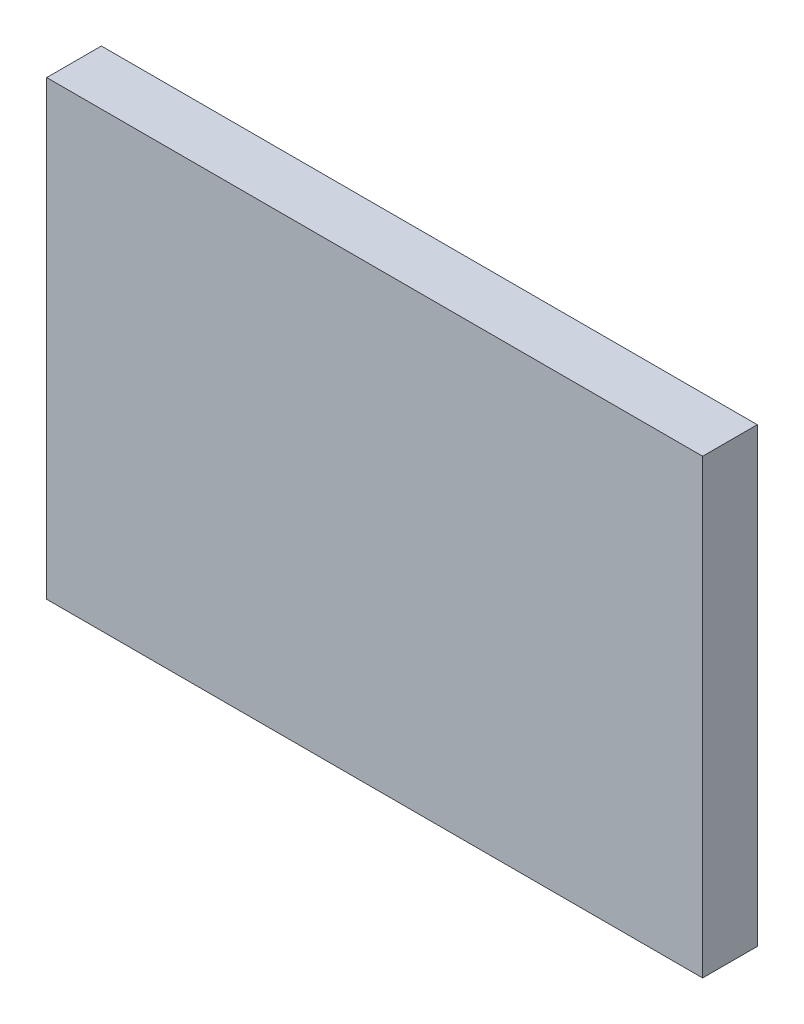
ISO-10303-21;
HEADER;
FILE_DESCRIPTION(('STEP AP214'),'2;1');
FILE_NAME('part.step','',(''),(''),'','','');
FILE_SCHEMA(('AUTOMOTIVE_DESIGN { 1 0 10303 214 1 1 1 1 }'));
ENDSEC;
DATA;
#1=APPLICATION_CONTEXT('core data for automotive mechanical design processes');
#2=APPLICATION_PROTOCOL_DEFINITION('international standard','automotive_design',2000,#1);
#3=PRODUCT_CONTEXT('',#1,'mechanical');
#4=PRODUCT('Part','Part','',(#3));
#5=PRODUCT_RELATED_PRODUCT_CATEGORY('part','',(#4));
#6=PRODUCT_DEFINITION_FORMATION('','',#4);
#7=PRODUCT_DEFINITION_CONTEXT('part definition',#1,'design');
#8=PRODUCT_DEFINITION('design','',#6,#7);
#9=PRODUCT_DEFINITION_SHAPE('','',#8);
#10=(LENGTH_UNIT() NAMED_UNIT(*) SI_UNIT(.MILLI.,.METRE.));
#11=(NAMED_UNIT(*) PLANE_ANGLE_UNIT() SI_UNIT($,.RADIAN.));
#12=(NAMED_UNIT(*) SI_UNIT($,.STERADIAN.) SOLID_ANGLE_UNIT());
#13=UNCERTAINTY_MEASURE_WITH_UNIT(LENGTH_MEASURE(1.E-05),#10,'distance_accuracy_value','');
#14=(GEOMETRIC_REPRESENTATION_CONTEXT(3) GLOBAL_UNCERTAINTY_ASSIGNED_CONTEXT((#13)) GLOBAL_UNIT_ASSIGNED_CONTEXT((#10,
#11,#12)) REPRESENTATION_CONTEXT('',''));
#15=CARTESIAN_POINT('',(0.,0.,0.));
#16=DIRECTION('',(0.,0.,1.));
#17=DIRECTION('',(1.,0.,0.));
#18=AXIS2_PLACEMENT_3D('',#15,#16,#17);
#19=CARTESIAN_POINT('',(22.86,-15.748,3.81));
#20=DIRECTION('',(-1.,0.,0.));
#21=DIRECTION('',(0.,0.,1.));
#22=AXIS2_PLACEMENT_3D('',#19,#20,#21);
#23=PLANE('',#22);
#24=DIRECTION('',(0.,1.,0.));
#25=VECTOR('',#24,1.);
#26=CARTESIAN_POINT('',(22.86,-15.748,0.));
#27=LINE('',#26,#25);
#28=CARTESIAN_POINT('',(22.86,-15.748,0.));
#29=VERTEX_POINT('',#28);
#30=CARTESIAN_POINT('',(22.86,15.748,0.));
#31=VERTEX_POINT('',#30);
#32=EDGE_CURVE('E111',#29,#31,#27,.T.);
#33=ORIENTED_EDGE('',*,*,#32,.T.);
#34=DIRECTION('',(0.,0.,-1.));
#35=VECTOR('',#34,1.);
#36=CARTESIAN_POINT('',(22.86,15.748,3.81));
#37=LINE('',#36,#35);
#38=CARTESIAN_POINT('',(22.86,15.748,3.81));
#39=VERTEX_POINT('',#38);
#40=EDGE_CURVE('E11',#39,#31,#37,.T.);
#41=ORIENTED_EDGE('',*,*,#40,.F.);
#42=DIRECTION('',(0.,1.,0.));
#43=VECTOR('',#42,1.);
#44=CARTESIAN_POINT('',(22.86,-15.748,3.81));
#45=LINE('',#44,#43);
#46=CARTESIAN_POINT('',(22.86,-15.748,3.81));
#47=VERTEX_POINT('',#46);
#48=EDGE_CURVE('E95',#47,#39,#45,.T.);
#49=ORIENTED_EDGE('',*,*,#48,.F.);
#50=DIRECTION('',(0.,0.,-1.));
#51=VECTOR('',#50,1.);
#52=CARTESIAN_POINT('',(22.86,-15.748,3.81));
#53=LINE('',#52,#51);
#54=EDGE_CURVE('E107',#47,#29,#53,.T.);
#55=ORIENTED_EDGE('',*,*,#54,.T.);
#56=EDGE_LOOP('',(#33,#41,#49,#55));
#57=FACE_BOUND('',#56,.T.);
#58=ADVANCED_FACE('F43',(#57),#23,.F.);
#59=CARTESIAN_POINT('',(-22.86,15.748,3.81));
#60=DIRECTION('',(0.,-1.,0.));
#61=DIRECTION('',(0.,0.,-1.));
#62=AXIS2_PLACEMENT_3D('',#59,#60,#61);
#63=PLANE('',#62);
#64=DIRECTION('',(-1.,0.,0.));
#65=VECTOR('',#64,1.);
#66=CARTESIAN_POINT('',(-22.86,15.748,0.));
#67=LINE('',#66,#65);
#68=CARTESIAN_POINT('',(-22.86,15.748,0.));
#69=VERTEX_POINT('',#68);
#70=EDGE_CURVE('E100',#31,#69,#67,.T.);
#71=ORIENTED_EDGE('',*,*,#70,.T.);
#72=DIRECTION('',(0.,0.,-1.));
#73=VECTOR('',#72,1.);
#74=CARTESIAN_POINT('',(-22.86,15.748,3.81));
#75=LINE('',#74,#73);
#76=CARTESIAN_POINT('',(-22.86,15.748,3.81));
#77=VERTEX_POINT('',#76);
#78=EDGE_CURVE('E52',#77,#69,#75,.T.);
#79=ORIENTED_EDGE('',*,*,#78,.F.);
#80=DIRECTION('',(-1.,0.,0.));
#81=VECTOR('',#80,1.);
#82=CARTESIAN_POINT('',(-22.86,15.748,3.81));
#83=LINE('',#82,#81);
#84=EDGE_CURVE('E90',#39,#77,#83,.T.);
#85=ORIENTED_EDGE('',*,*,#84,.F.);
#86=ORIENTED_EDGE('',*,*,#40,.T.);
#87=EDGE_LOOP('',(#71,#79,#85,#86));
#88=FACE_BOUND('',#87,.T.);
#89=ADVANCED_FACE('F99',(#88),#63,.F.);
#90=CARTESIAN_POINT('',(-22.86,-15.748,3.81));
#91=DIRECTION('',(1.,0.,0.));
#92=DIRECTION('',(0.,0.,-1.));
#93=AXIS2_PLACEMENT_3D('',#90,#91,#92);
#94=PLANE('',#93);
#95=DIRECTION('',(0.,-1.,0.));
#96=VECTOR('',#95,1.);
#97=CARTESIAN_POINT('',(-22.86,-15.748,0.));
#98=LINE('',#97,#96);
#99=CARTESIAN_POINT('',(-22.86,-15.748,0.));
#100=VERTEX_POINT('',#99);
#101=EDGE_CURVE('E77',#69,#100,#98,.T.);
#102=ORIENTED_EDGE('',*,*,#101,.T.);
#103=DIRECTION('',(0.,0.,-1.));
#104=VECTOR('',#103,1.);
#105=CARTESIAN_POINT('',(-22.86,-15.748,3.81));
#106=LINE('',#105,#104);
#107=CARTESIAN_POINT('',(-22.86,-15.748,3.81));
#108=VERTEX_POINT('',#107);
#109=EDGE_CURVE('E102',#108,#100,#106,.T.);
#110=ORIENTED_EDGE('',*,*,#109,.F.);
#111=DIRECTION('',(0.,-1.,0.));
#112=VECTOR('',#111,1.);
#113=CARTESIAN_POINT('',(-22.86,-15.748,3.81));
#114=LINE('',#113,#112);
#115=EDGE_CURVE('E93',#77,#108,#114,.T.);
#116=ORIENTED_EDGE('',*,*,#115,.F.);
#117=ORIENTED_EDGE('',*,*,#78,.T.);
#118=EDGE_LOOP('',(#102,#110,#116,#117));
#119=FACE_BOUND('',#118,.T.);
#120=ADVANCED_FACE('F103',(#119),#94,.F.);
#121=CARTESIAN_POINT('',(-22.86,-15.748,3.81));
#122=DIRECTION('',(0.,1.,0.));
#123=DIRECTION('',(0.,0.,1.));
#124=AXIS2_PLACEMENT_3D('',#121,#122,#123);
#125=PLANE('',#124);
#126=DIRECTION('',(1.,0.,0.));
#127=VECTOR('',#126,1.);
#128=CARTESIAN_POINT('',(-22.86,-15.748,0.));
#129=LINE('',#128,#127);
#130=EDGE_CURVE('E83',#100,#29,#129,.T.);
#131=ORIENTED_EDGE('',*,*,#130,.T.);
#132=ORIENTED_EDGE('',*,*,#54,.F.);
#133=DIRECTION('',(1.,0.,0.));
#134=VECTOR('',#133,1.);
#135=CARTESIAN_POINT('',(-22.86,-15.748,3.81));
#136=LINE('',#135,#134);
#137=EDGE_CURVE('E60',#108,#47,#136,.T.);
#138=ORIENTED_EDGE('',*,*,#137,.F.);
#139=ORIENTED_EDGE('',*,*,#109,.T.);
#140=EDGE_LOOP('',(#131,#132,#138,#139));
#141=FACE_BOUND('',#140,.T.);
#142=ADVANCED_FACE('F124',(#141),#125,.F.);
#143=CARTESIAN_POINT('',(0.,0.,3.81));
#144=DIRECTION('',(0.,0.,-1.));
#145=DIRECTION('',(-1.,0.,0.));
#146=AXIS2_PLACEMENT_3D('',#143,#144,#145);
#147=PLANE('',#146);
#148=ORIENTED_EDGE('',*,*,#48,.T.);
#149=ORIENTED_EDGE('',*,*,#84,.T.);
#150=ORIENTED_EDGE('',*,*,#115,.T.);
#151=ORIENTED_EDGE('',*,*,#137,.T.);
#152=EDGE_LOOP('',(#148,#149,#150,#151));
#153=FACE_BOUND('',#152,.T.);
#154=ADVANCED_FACE('F91',(#153),#147,.F.);
#155=CARTESIAN_POINT('',(0.,0.,0.));
#156=DIRECTION('',(0.,0.,-1.));
#157=DIRECTION('',(-1.,0.,0.));
#158=AXIS2_PLACEMENT_3D('',#155,#156,#157);
#159=PLANE('',#158);
#160=ORIENTED_EDGE('',*,*,#32,.F.);
#161=ORIENTED_EDGE('',*,*,#130,.F.);
#162=ORIENTED_EDGE('',*,*,#101,.F.);
#163=ORIENTED_EDGE('',*,*,#70,.F.);
#164=EDGE_LOOP('',(#160,#161,#162,#163));
#165=FACE_BOUND('',#164,.T.);
#166=ADVANCED_FACE('F127',(#165),#159,.T.);
#167=CLOSED_SHELL('',(#58,#89,#120,#142,#154,#166));
#168=MANIFOLD_SOLID_BREP('B2',#167);
#169=ADVANCED_BREP_SHAPE_REPRESENTATION('',(#18,#168),#14);
#170=SHAPE_DEFINITION_REPRESENTATION(#9,#169);
ENDSEC;
END-ISO-10303-21;
